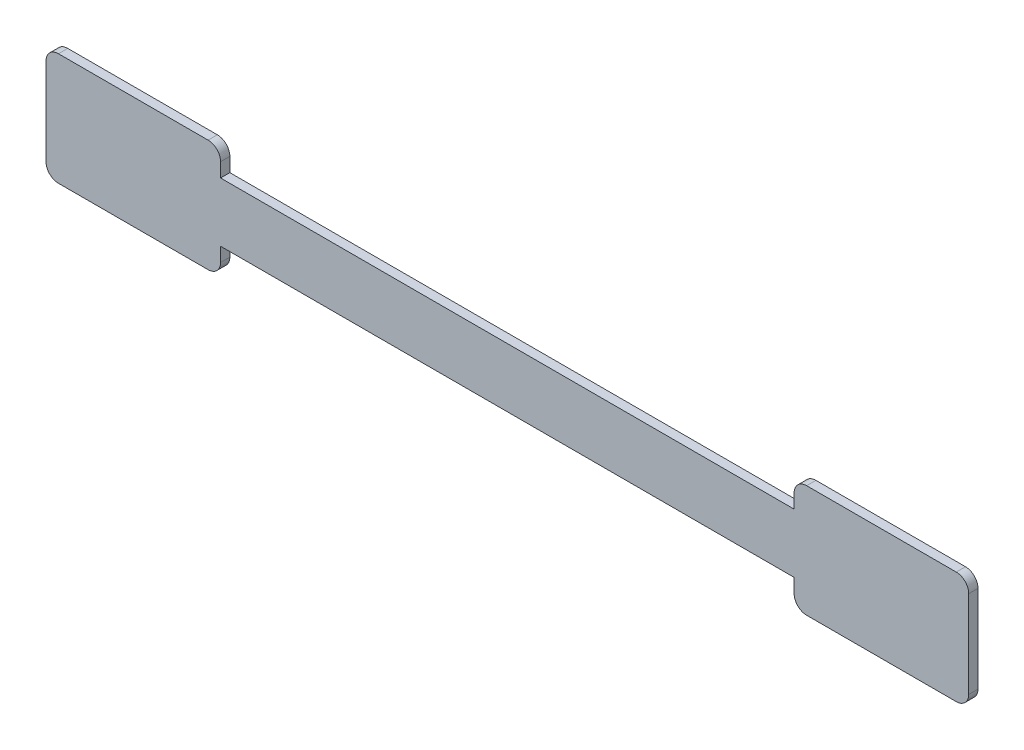
ISO-10303-21;
HEADER;
FILE_DESCRIPTION(('STEP AP214'),'2;1');
FILE_NAME('part.step','',(''),(''),'','','');
FILE_SCHEMA(('AUTOMOTIVE_DESIGN { 1 0 10303 214 1 1 1 1 }'));
ENDSEC;
DATA;
#1=APPLICATION_CONTEXT('core data for automotive mechanical design processes');
#2=APPLICATION_PROTOCOL_DEFINITION('international standard','automotive_design',2000,#1);
#3=PRODUCT_CONTEXT('',#1,'mechanical');
#4=PRODUCT('Part','Part','',(#3));
#5=PRODUCT_RELATED_PRODUCT_CATEGORY('part','',(#4));
#6=PRODUCT_DEFINITION_FORMATION('','',#4);
#7=PRODUCT_DEFINITION_CONTEXT('part definition',#1,'design');
#8=PRODUCT_DEFINITION('design','',#6,#7);
#9=PRODUCT_DEFINITION_SHAPE('','',#8);
#10=(LENGTH_UNIT() NAMED_UNIT(*) SI_UNIT(.MILLI.,.METRE.));
#11=(NAMED_UNIT(*) PLANE_ANGLE_UNIT() SI_UNIT($,.RADIAN.));
#12=(NAMED_UNIT(*) SI_UNIT($,.STERADIAN.) SOLID_ANGLE_UNIT());
#13=UNCERTAINTY_MEASURE_WITH_UNIT(LENGTH_MEASURE(1.E-05),#10,'distance_accuracy_value','');
#14=(GEOMETRIC_REPRESENTATION_CONTEXT(3) GLOBAL_UNCERTAINTY_ASSIGNED_CONTEXT((#13)) GLOBAL_UNIT_ASSIGNED_CONTEXT((#10,
#11,#12)) REPRESENTATION_CONTEXT('',''));
#15=CARTESIAN_POINT('',(0.,0.,0.));
#16=DIRECTION('',(0.,0.,1.));
#17=DIRECTION('',(1.,0.,0.));
#18=AXIS2_PLACEMENT_3D('',#15,#16,#17);
#19=CARTESIAN_POINT('',(0.513181159420287,10.3931811594203,0.));
#20=DIRECTION('',(0.,0.,-1.));
#21=DIRECTION('',(-0.000362187589422425,-0.999999934410073,0.));
#22=AXIS2_PLACEMENT_3D('',#19,#20,#21);
#23=CYLINDRICAL_SURFACE('',#22,0.500181192227135);
#24=DIRECTION('',(0.,0.,1.));
#25=VECTOR('',#24,1.);
#26=CARTESIAN_POINT('',(0.513,9.893,0.));
#27=LINE('',#26,#25);
#28=CARTESIAN_POINT('',(0.513,9.89300000000001,0.02));
#29=VERTEX_POINT('',#28);
#30=CARTESIAN_POINT('',(0.513,9.893,0.39148));
#31=VERTEX_POINT('',#30);
#32=EDGE_CURVE('E11',#29,#31,#27,.T.);
#33=ORIENTED_EDGE('',*,*,#32,.T.);
#34=CARTESIAN_POINT('',(0.513181159420287,10.3931811594203,0.39148));
#35=DIRECTION('',(0.,0.,1.));
#36=DIRECTION('',(1.,0.,0.));
#37=AXIS2_PLACEMENT_3D('',#34,#35,#36);
#38=CIRCLE('',#37,0.500181192227141);
#39=CARTESIAN_POINT('',(0.0130000000000003,10.393,0.39148));
#40=VERTEX_POINT('',#39);
#41=EDGE_CURVE('E50',#40,#31,#38,.T.);
#42=ORIENTED_EDGE('',*,*,#41,.F.);
#43=DIRECTION('',(0.,0.,1.));
#44=VECTOR('',#43,1.);
#45=CARTESIAN_POINT('',(0.0130000000000003,10.393,0.));
#46=LINE('',#45,#44);
#47=CARTESIAN_POINT('',(0.0129999999999945,10.393,0.02));
#48=VERTEX_POINT('',#47);
#49=EDGE_CURVE('E43',#48,#40,#46,.T.);
#50=ORIENTED_EDGE('',*,*,#49,.F.);
#51=CARTESIAN_POINT('',(0.513181159420287,10.3931811594203,0.02));
#52=DIRECTION('',(0.,0.,-1.));
#53=DIRECTION('',(-1.,0.,0.));
#54=AXIS2_PLACEMENT_3D('',#51,#52,#53);
#55=CIRCLE('',#54,0.500181192227141);
#56=EDGE_CURVE('E252',#29,#48,#55,.T.);
#57=ORIENTED_EDGE('',*,*,#56,.F.);
#58=EDGE_LOOP('',(#33,#42,#50,#57));
#59=FACE_BOUND('',#58,.T.);
#60=ADVANCED_FACE('F36',(#59),#23,.T.);
#61=CARTESIAN_POINT('',(0.013,10.393,0.));
#62=DIRECTION('',(-1.,0.,0.));
#63=DIRECTION('',(0.,1.,0.));
#64=AXIS2_PLACEMENT_3D('',#61,#62,#63);
#65=PLANE('',#64);
#66=ORIENTED_EDGE('',*,*,#49,.T.);
#67=DIRECTION('',(0.,-1.,0.));
#68=VECTOR('',#67,1.);
#69=CARTESIAN_POINT('',(0.0129999999999856,13.893,0.39148));
#70=LINE('',#69,#68);
#71=CARTESIAN_POINT('',(0.0129999999999783,13.893,0.39148));
#72=VERTEX_POINT('',#71);
#73=EDGE_CURVE('E248',#72,#40,#70,.T.);
#74=ORIENTED_EDGE('',*,*,#73,.F.);
#75=DIRECTION('',(0.,0.,1.));
#76=VECTOR('',#75,1.);
#77=CARTESIAN_POINT('',(0.0130000000000001,13.893,0.));
#78=LINE('',#77,#76);
#79=CARTESIAN_POINT('',(0.0129999999999925,13.893,0.02));
#80=VERTEX_POINT('',#79);
#81=EDGE_CURVE('E239',#80,#72,#78,.T.);
#82=ORIENTED_EDGE('',*,*,#81,.F.);
#83=DIRECTION('',(0.,1.,0.));
#84=VECTOR('',#83,1.);
#85=CARTESIAN_POINT('',(0.0129999999999945,10.393,0.02));
#86=LINE('',#85,#84);
#87=EDGE_CURVE('E249',#48,#80,#86,.T.);
#88=ORIENTED_EDGE('',*,*,#87,.F.);
#89=EDGE_LOOP('',(#66,#74,#82,#88));
#90=FACE_BOUND('',#89,.T.);
#91=ADVANCED_FACE('F246',(#90),#65,.T.);
#92=CARTESIAN_POINT('',(0.511480769230771,13.8945192307692,0.));
#93=DIRECTION('',(0.,0.,-1.));
#94=DIRECTION('',(-0.99999535572789,-0.0030477077698561,0.));
#95=AXIS2_PLACEMENT_3D('',#92,#93,#94);
#96=CYLINDRICAL_SURFACE('',#95,0.498483084321856);
#97=ORIENTED_EDGE('',*,*,#81,.T.);
#98=CARTESIAN_POINT('',(0.511480769230771,13.8945192307692,0.39148));
#99=DIRECTION('',(0.,0.,1.));
#100=DIRECTION('',(1.,0.,0.));
#101=AXIS2_PLACEMENT_3D('',#98,#99,#100);
#102=CIRCLE('',#101,0.498483084321878);
#103=CARTESIAN_POINT('',(0.513,14.393,0.39148));
#104=VERTEX_POINT('',#103);
#105=EDGE_CURVE('E284',#104,#72,#102,.T.);
#106=ORIENTED_EDGE('',*,*,#105,.F.);
#107=DIRECTION('',(0.,0.,1.));
#108=VECTOR('',#107,1.);
#109=CARTESIAN_POINT('',(0.513,14.393,0.));
#110=LINE('',#109,#108);
#111=CARTESIAN_POINT('',(0.513,14.393,0.02));
#112=VERTEX_POINT('',#111);
#113=EDGE_CURVE('E236',#112,#104,#110,.T.);
#114=ORIENTED_EDGE('',*,*,#113,.F.);
#115=CARTESIAN_POINT('',(0.511480769230771,13.8945192307692,0.02));
#116=DIRECTION('',(0.,0.,-1.));
#117=DIRECTION('',(-1.,0.,0.));
#118=AXIS2_PLACEMENT_3D('',#115,#116,#117);
#119=CIRCLE('',#118,0.498483084321864);
#120=EDGE_CURVE('E289',#80,#112,#119,.T.);
#121=ORIENTED_EDGE('',*,*,#120,.F.);
#122=EDGE_LOOP('',(#97,#106,#114,#121));
#123=FACE_BOUND('',#122,.T.);
#124=ADVANCED_FACE('F397',(#123),#96,.T.);
#125=CARTESIAN_POINT('',(0.513,14.393,0.));
#126=DIRECTION('',(0.,1.,0.));
#127=DIRECTION('',(1.,0.,0.));
#128=AXIS2_PLACEMENT_3D('',#125,#126,#127);
#129=PLANE('',#128);
#130=ORIENTED_EDGE('',*,*,#113,.T.);
#131=DIRECTION('',(-1.,0.,0.));
#132=VECTOR('',#131,1.);
#133=CARTESIAN_POINT('',(6.513,14.393,0.39148));
#134=LINE('',#133,#132);
#135=CARTESIAN_POINT('',(6.513,14.393,0.39148));
#136=VERTEX_POINT('',#135);
#137=EDGE_CURVE('E282',#136,#104,#134,.T.);
#138=ORIENTED_EDGE('',*,*,#137,.F.);
#139=DIRECTION('',(0.,0.,1.));
#140=VECTOR('',#139,1.);
#141=CARTESIAN_POINT('',(6.513,14.393,0.));
#142=LINE('',#141,#140);
#143=CARTESIAN_POINT('',(6.513,14.393,0.02));
#144=VERTEX_POINT('',#143);
#145=EDGE_CURVE('E233',#144,#136,#142,.T.);
#146=ORIENTED_EDGE('',*,*,#145,.F.);
#147=DIRECTION('',(1.,0.,0.));
#148=VECTOR('',#147,1.);
#149=CARTESIAN_POINT('',(0.513,14.393,0.02));
#150=LINE('',#149,#148);
#151=EDGE_CURVE('E291',#112,#144,#150,.T.);
#152=ORIENTED_EDGE('',*,*,#151,.F.);
#153=EDGE_LOOP('',(#130,#138,#146,#152));
#154=FACE_BOUND('',#153,.T.);
#155=ADVANCED_FACE('F393',(#154),#129,.T.);
#156=CARTESIAN_POINT('',(6.5128188405797,13.8928188405797,0.));
#157=DIRECTION('',(0.,0.,-1.));
#158=DIRECTION('',(0.0003621875894313,0.999999934410073,0.));
#159=AXIS2_PLACEMENT_3D('',#156,#157,#158);
#160=CYLINDRICAL_SURFACE('',#159,0.50018119222714);
#161=ORIENTED_EDGE('',*,*,#145,.T.);
#162=CARTESIAN_POINT('',(6.5128188405797,13.8928188405797,0.39148));
#163=DIRECTION('',(0.,0.,1.));
#164=DIRECTION('',(1.,0.,0.));
#165=AXIS2_PLACEMENT_3D('',#162,#163,#164);
#166=CIRCLE('',#165,0.500181192227148);
#167=CARTESIAN_POINT('',(7.013,13.893,0.39148));
#168=VERTEX_POINT('',#167);
#169=EDGE_CURVE('E280',#168,#136,#166,.T.);
#170=ORIENTED_EDGE('',*,*,#169,.F.);
#171=DIRECTION('',(0.,0.,1.));
#172=VECTOR('',#171,1.);
#173=CARTESIAN_POINT('',(7.013,13.893,0.));
#174=LINE('',#173,#172);
#175=CARTESIAN_POINT('',(7.013,13.893,0.02));
#176=VERTEX_POINT('',#175);
#177=EDGE_CURVE('E230',#176,#168,#174,.T.);
#178=ORIENTED_EDGE('',*,*,#177,.F.);
#179=CARTESIAN_POINT('',(6.5128188405797,13.8928188405797,0.02));
#180=DIRECTION('',(0.,0.,-1.));
#181=DIRECTION('',(-1.,0.,0.));
#182=AXIS2_PLACEMENT_3D('',#179,#180,#181);
#183=CIRCLE('',#182,0.500181192227148);
#184=EDGE_CURVE('E293',#144,#176,#183,.T.);
#185=ORIENTED_EDGE('',*,*,#184,.F.);
#186=EDGE_LOOP('',(#161,#170,#178,#185));
#187=FACE_BOUND('',#186,.T.);
#188=ADVANCED_FACE('F388',(#187),#160,.T.);
#189=CARTESIAN_POINT('',(7.013,13.893,0.));
#190=DIRECTION('',(1.,0.,0.));
#191=DIRECTION('',(0.,-1.,0.));
#192=AXIS2_PLACEMENT_3D('',#189,#190,#191);
#193=PLANE('',#192);
#194=ORIENTED_EDGE('',*,*,#177,.T.);
#195=DIRECTION('',(0.,1.,0.));
#196=VECTOR('',#195,1.);
#197=CARTESIAN_POINT('',(7.013,13.328,0.39148));
#198=LINE('',#197,#196);
#199=CARTESIAN_POINT('',(7.013,13.328,0.39148));
#200=VERTEX_POINT('',#199);
#201=EDGE_CURVE('E278',#200,#168,#198,.T.);
#202=ORIENTED_EDGE('',*,*,#201,.F.);
#203=DIRECTION('',(0.,0.,1.));
#204=VECTOR('',#203,1.);
#205=CARTESIAN_POINT('',(7.013,13.328,0.));
#206=LINE('',#205,#204);
#207=CARTESIAN_POINT('',(7.013,13.328,0.02));
#208=VERTEX_POINT('',#207);
#209=EDGE_CURVE('E227',#208,#200,#206,.T.);
#210=ORIENTED_EDGE('',*,*,#209,.F.);
#211=DIRECTION('',(0.,-1.,0.));
#212=VECTOR('',#211,1.);
#213=CARTESIAN_POINT('',(7.013,13.893,0.02));
#214=LINE('',#213,#212);
#215=EDGE_CURVE('E295',#176,#208,#214,.T.);
#216=ORIENTED_EDGE('',*,*,#215,.F.);
#217=EDGE_LOOP('',(#194,#202,#210,#216));
#218=FACE_BOUND('',#217,.T.);
#219=ADVANCED_FACE('F383',(#218),#193,.T.);
#220=CARTESIAN_POINT('',(7.013,13.328,0.));
#221=DIRECTION('',(0.,1.,0.));
#222=DIRECTION('',(1.,0.,0.));
#223=AXIS2_PLACEMENT_3D('',#220,#221,#222);
#224=PLANE('',#223);
#225=ORIENTED_EDGE('',*,*,#209,.T.);
#226=DIRECTION('',(-1.,0.,0.));
#227=VECTOR('',#226,1.);
#228=CARTESIAN_POINT('',(30.013,13.328,0.39148));
#229=LINE('',#228,#227);
#230=CARTESIAN_POINT('',(30.013,13.328,0.39148));
#231=VERTEX_POINT('',#230);
#232=EDGE_CURVE('E276',#231,#200,#229,.T.);
#233=ORIENTED_EDGE('',*,*,#232,.F.);
#234=DIRECTION('',(0.,0.,1.));
#235=VECTOR('',#234,1.);
#236=CARTESIAN_POINT('',(30.013,13.328,0.));
#237=LINE('',#236,#235);
#238=CARTESIAN_POINT('',(30.013,13.328,0.02));
#239=VERTEX_POINT('',#238);
#240=EDGE_CURVE('E224',#239,#231,#237,.T.);
#241=ORIENTED_EDGE('',*,*,#240,.F.);
#242=DIRECTION('',(1.,0.,0.));
#243=VECTOR('',#242,1.);
#244=CARTESIAN_POINT('',(7.013,13.328,0.02));
#245=LINE('',#244,#243);
#246=EDGE_CURVE('E297',#208,#239,#245,.T.);
#247=ORIENTED_EDGE('',*,*,#246,.F.);
#248=EDGE_LOOP('',(#225,#233,#241,#247));
#249=FACE_BOUND('',#248,.T.);
#250=ADVANCED_FACE('F378',(#249),#224,.T.);
#251=CARTESIAN_POINT('',(30.013,13.328,0.));
#252=DIRECTION('',(-1.,0.,0.));
#253=DIRECTION('',(0.,1.,0.));
#254=AXIS2_PLACEMENT_3D('',#251,#252,#253);
#255=PLANE('',#254);
#256=ORIENTED_EDGE('',*,*,#240,.T.);
#257=DIRECTION('',(0.,-1.,0.));
#258=VECTOR('',#257,1.);
#259=CARTESIAN_POINT('',(30.013,13.893,0.39148));
#260=LINE('',#259,#258);
#261=CARTESIAN_POINT('',(30.013,13.893,0.39148));
#262=VERTEX_POINT('',#261);
#263=EDGE_CURVE('E274',#262,#231,#260,.T.);
#264=ORIENTED_EDGE('',*,*,#263,.F.);
#265=DIRECTION('',(0.,0.,1.));
#266=VECTOR('',#265,1.);
#267=CARTESIAN_POINT('',(30.013,13.893,0.));
#268=LINE('',#267,#266);
#269=CARTESIAN_POINT('',(30.013,13.893,0.02));
#270=VERTEX_POINT('',#269);
#271=EDGE_CURVE('E221',#270,#262,#268,.T.);
#272=ORIENTED_EDGE('',*,*,#271,.F.);
#273=DIRECTION('',(0.,1.,0.));
#274=VECTOR('',#273,1.);
#275=CARTESIAN_POINT('',(30.013,13.328,0.02));
#276=LINE('',#275,#274);
#277=EDGE_CURVE('E299',#239,#270,#276,.T.);
#278=ORIENTED_EDGE('',*,*,#277,.F.);
#279=EDGE_LOOP('',(#256,#264,#272,#278));
#280=FACE_BOUND('',#279,.T.);
#281=ADVANCED_FACE('F373',(#280),#255,.T.);
#282=CARTESIAN_POINT('',(30.5114807692308,13.8945192307692,0.));
#283=DIRECTION('',(0.,0.,-1.));
#284=DIRECTION('',(-0.99999535572789,-0.0030477077698633,0.));
#285=AXIS2_PLACEMENT_3D('',#282,#283,#284);
#286=CYLINDRICAL_SURFACE('',#285,0.498483084321851);
#287=ORIENTED_EDGE('',*,*,#271,.T.);
#288=CARTESIAN_POINT('',(30.5114807692308,13.8945192307692,0.39148));
#289=DIRECTION('',(0.,0.,1.));
#290=DIRECTION('',(1.,0.,0.));
#291=AXIS2_PLACEMENT_3D('',#288,#289,#290);
#292=CIRCLE('',#291,0.498483084321885);
#293=CARTESIAN_POINT('',(30.513,14.393,0.39148));
#294=VERTEX_POINT('',#293);
#295=EDGE_CURVE('E272',#294,#262,#292,.T.);
#296=ORIENTED_EDGE('',*,*,#295,.F.);
#297=DIRECTION('',(0.,0.,1.));
#298=VECTOR('',#297,1.);
#299=CARTESIAN_POINT('',(30.513,14.393,0.));
#300=LINE('',#299,#298);
#301=CARTESIAN_POINT('',(30.513,14.393,0.02));
#302=VERTEX_POINT('',#301);
#303=EDGE_CURVE('E218',#302,#294,#300,.T.);
#304=ORIENTED_EDGE('',*,*,#303,.F.);
#305=CARTESIAN_POINT('',(30.5114807692308,13.8945192307692,0.02));
#306=DIRECTION('',(0.,0.,-1.));
#307=DIRECTION('',(-1.,0.,0.));
#308=AXIS2_PLACEMENT_3D('',#305,#306,#307);
#309=CIRCLE('',#308,0.498483084321885);
#310=EDGE_CURVE('E301',#270,#302,#309,.T.);
#311=ORIENTED_EDGE('',*,*,#310,.F.);
#312=EDGE_LOOP('',(#287,#296,#304,#311));
#313=FACE_BOUND('',#312,.T.);
#314=ADVANCED_FACE('F368',(#313),#286,.T.);
#315=CARTESIAN_POINT('',(30.513,14.393,0.));
#316=DIRECTION('',(0.,1.,0.));
#317=DIRECTION('',(1.,0.,0.));
#318=AXIS2_PLACEMENT_3D('',#315,#316,#317);
#319=PLANE('',#318);
#320=ORIENTED_EDGE('',*,*,#303,.T.);
#321=DIRECTION('',(-1.,0.,0.));
#322=VECTOR('',#321,1.);
#323=CARTESIAN_POINT('',(36.513,14.393,0.39148));
#324=LINE('',#323,#322);
#325=CARTESIAN_POINT('',(36.513,14.393,0.39148));
#326=VERTEX_POINT('',#325);
#327=EDGE_CURVE('E270',#326,#294,#324,.T.);
#328=ORIENTED_EDGE('',*,*,#327,.F.);
#329=DIRECTION('',(0.,0.,1.));
#330=VECTOR('',#329,1.);
#331=CARTESIAN_POINT('',(36.513,14.393,0.));
#332=LINE('',#331,#330);
#333=CARTESIAN_POINT('',(36.513,14.393,0.02));
#334=VERTEX_POINT('',#333);
#335=EDGE_CURVE('E215',#334,#326,#332,.T.);
#336=ORIENTED_EDGE('',*,*,#335,.F.);
#337=DIRECTION('',(1.,0.,0.));
#338=VECTOR('',#337,1.);
#339=CARTESIAN_POINT('',(30.513,14.393,0.02));
#340=LINE('',#339,#338);
#341=EDGE_CURVE('E303',#302,#334,#340,.T.);
#342=ORIENTED_EDGE('',*,*,#341,.F.);
#343=EDGE_LOOP('',(#320,#328,#336,#342));
#344=FACE_BOUND('',#343,.T.);
#345=ADVANCED_FACE('F363',(#344),#319,.T.);
#346=CARTESIAN_POINT('',(36.5128188405797,13.8928188405797,0.));
#347=DIRECTION('',(0.,0.,-1.));
#348=DIRECTION('',(0.000362187589434854,0.999999934410073,0.));
#349=AXIS2_PLACEMENT_3D('',#346,#347,#348);
#350=CYLINDRICAL_SURFACE('',#349,0.500181192227139);
#351=ORIENTED_EDGE('',*,*,#335,.T.);
#352=CARTESIAN_POINT('',(36.5128188405797,13.8928188405797,0.39148));
#353=DIRECTION('',(0.,0.,1.));
#354=DIRECTION('',(1.,0.,0.));
#355=AXIS2_PLACEMENT_3D('',#352,#353,#354);
#356=CIRCLE('',#355,0.500181192227148);
#357=CARTESIAN_POINT('',(37.013,13.893,0.39148));
#358=VERTEX_POINT('',#357);
#359=EDGE_CURVE('E268',#358,#326,#356,.T.);
#360=ORIENTED_EDGE('',*,*,#359,.F.);
#361=DIRECTION('',(0.,0.,1.));
#362=VECTOR('',#361,1.);
#363=CARTESIAN_POINT('',(37.013,13.893,0.));
#364=LINE('',#363,#362);
#365=CARTESIAN_POINT('',(37.013,13.893,0.02));
#366=VERTEX_POINT('',#365);
#367=EDGE_CURVE('E212',#366,#358,#364,.T.);
#368=ORIENTED_EDGE('',*,*,#367,.F.);
#369=CARTESIAN_POINT('',(36.5128188405797,13.8928188405797,0.02));
#370=DIRECTION('',(0.,0.,-1.));
#371=DIRECTION('',(-1.,0.,0.));
#372=AXIS2_PLACEMENT_3D('',#369,#370,#371);
#373=CIRCLE('',#372,0.500181192227148);
#374=EDGE_CURVE('E305',#334,#366,#373,.T.);
#375=ORIENTED_EDGE('',*,*,#374,.F.);
#376=EDGE_LOOP('',(#351,#360,#368,#375));
#377=FACE_BOUND('',#376,.T.);
#378=ADVANCED_FACE('F358',(#377),#350,.T.);
#379=CARTESIAN_POINT('',(37.013,13.893,0.));
#380=DIRECTION('',(1.,0.,0.));
#381=DIRECTION('',(0.,-1.,0.));
#382=AXIS2_PLACEMENT_3D('',#379,#380,#381);
#383=PLANE('',#382);
#384=ORIENTED_EDGE('',*,*,#367,.T.);
#385=DIRECTION('',(0.,1.,0.));
#386=VECTOR('',#385,1.);
#387=CARTESIAN_POINT('',(37.013,10.393,0.39148));
#388=LINE('',#387,#386);
#389=CARTESIAN_POINT('',(37.013,10.393,0.39148));
#390=VERTEX_POINT('',#389);
#391=EDGE_CURVE('E266',#390,#358,#388,.T.);
#392=ORIENTED_EDGE('',*,*,#391,.F.);
#393=DIRECTION('',(0.,0.,1.));
#394=VECTOR('',#393,1.);
#395=CARTESIAN_POINT('',(37.013,10.393,0.));
#396=LINE('',#395,#394);
#397=CARTESIAN_POINT('',(37.013,10.393,0.02));
#398=VERTEX_POINT('',#397);
#399=EDGE_CURVE('E209',#398,#390,#396,.T.);
#400=ORIENTED_EDGE('',*,*,#399,.F.);
#401=DIRECTION('',(0.,-1.,0.));
#402=VECTOR('',#401,1.);
#403=CARTESIAN_POINT('',(37.013,13.893,0.02));
#404=LINE('',#403,#402);
#405=EDGE_CURVE('E307',#366,#398,#404,.T.);
#406=ORIENTED_EDGE('',*,*,#405,.F.);
#407=EDGE_LOOP('',(#384,#392,#400,#406));
#408=FACE_BOUND('',#407,.T.);
#409=ADVANCED_FACE('F353',(#408),#383,.T.);
#410=CARTESIAN_POINT('',(36.5111019417476,10.3948980582524,0.));
#411=DIRECTION('',(0.,0.,-1.));
#412=DIRECTION('',(0.999992849220456,-0.003781733458852,0.));
#413=AXIS2_PLACEMENT_3D('',#410,#411,#412);
#414=CYLINDRICAL_SURFACE('',#413,0.501901647240454);
#415=ORIENTED_EDGE('',*,*,#399,.T.);
#416=CARTESIAN_POINT('',(36.5111019417476,10.3948980582524,0.39148));
#417=DIRECTION('',(0.,0.,1.));
#418=DIRECTION('',(1.,0.,0.));
#419=AXIS2_PLACEMENT_3D('',#416,#417,#418);
#420=CIRCLE('',#419,0.50190164724043);
#421=CARTESIAN_POINT('',(36.513,9.893,0.39148));
#422=VERTEX_POINT('',#421);
#423=EDGE_CURVE('E264',#422,#390,#420,.T.);
#424=ORIENTED_EDGE('',*,*,#423,.F.);
#425=DIRECTION('',(0.,0.,1.));
#426=VECTOR('',#425,1.);
#427=CARTESIAN_POINT('',(36.513,9.893,0.));
#428=LINE('',#427,#426);
#429=CARTESIAN_POINT('',(36.513,9.893,0.02));
#430=VERTEX_POINT('',#429);
#431=EDGE_CURVE('E206',#430,#422,#428,.T.);
#432=ORIENTED_EDGE('',*,*,#431,.F.);
#433=CARTESIAN_POINT('',(36.5111019417476,10.3948980582524,0.02));
#434=DIRECTION('',(0.,0.,-1.));
#435=DIRECTION('',(-1.,0.,0.));
#436=AXIS2_PLACEMENT_3D('',#433,#434,#435);
#437=CIRCLE('',#436,0.501901647240429);
#438=EDGE_CURVE('E309',#398,#430,#437,.T.);
#439=ORIENTED_EDGE('',*,*,#438,.F.);
#440=EDGE_LOOP('',(#415,#424,#432,#439));
#441=FACE_BOUND('',#440,.T.);
#442=ADVANCED_FACE('F348',(#441),#414,.T.);
#443=CARTESIAN_POINT('',(36.513,9.893,0.));
#444=DIRECTION('',(0.,-1.,0.));
#445=DIRECTION('',(-1.,0.,0.));
#446=AXIS2_PLACEMENT_3D('',#443,#444,#445);
#447=PLANE('',#446);
#448=ORIENTED_EDGE('',*,*,#431,.T.);
#449=DIRECTION('',(1.,0.,0.));
#450=VECTOR('',#449,1.);
#451=CARTESIAN_POINT('',(30.513,9.893,0.39148));
#452=LINE('',#451,#450);
#453=CARTESIAN_POINT('',(30.513,9.893,0.39148));
#454=VERTEX_POINT('',#453);
#455=EDGE_CURVE('E262',#454,#422,#452,.T.);
#456=ORIENTED_EDGE('',*,*,#455,.F.);
#457=DIRECTION('',(0.,0.,1.));
#458=VECTOR('',#457,1.);
#459=CARTESIAN_POINT('',(30.513,9.893,0.));
#460=LINE('',#459,#458);
#461=CARTESIAN_POINT('',(30.513,9.893,0.02));
#462=VERTEX_POINT('',#461);
#463=EDGE_CURVE('E203',#462,#454,#460,.T.);
#464=ORIENTED_EDGE('',*,*,#463,.F.);
#465=DIRECTION('',(-1.,0.,0.));
#466=VECTOR('',#465,1.);
#467=CARTESIAN_POINT('',(36.513,9.893,0.02));
#468=LINE('',#467,#466);
#469=EDGE_CURVE('E311',#430,#462,#468,.T.);
#470=ORIENTED_EDGE('',*,*,#469,.F.);
#471=EDGE_LOOP('',(#448,#456,#464,#470));
#472=FACE_BOUND('',#471,.T.);
#473=ADVANCED_FACE('F343',(#472),#447,.T.);
#474=CARTESIAN_POINT('',(30.5131811594203,10.3931811594203,0.));
#475=DIRECTION('',(0.,0.,-1.));
#476=DIRECTION('',(-0.000362187589413549,-0.999999934410073,0.));
#477=AXIS2_PLACEMENT_3D('',#474,#475,#476);
#478=CYLINDRICAL_SURFACE('',#477,0.500181192227131);
#479=ORIENTED_EDGE('',*,*,#463,.T.);
#480=CARTESIAN_POINT('',(30.5131811594203,10.3931811594203,0.39148));
#481=DIRECTION('',(0.,0.,1.));
#482=DIRECTION('',(1.,0.,0.));
#483=AXIS2_PLACEMENT_3D('',#480,#481,#482);
#484=CIRCLE('',#483,0.500181192227147);
#485=CARTESIAN_POINT('',(30.013,10.393,0.39148));
#486=VERTEX_POINT('',#485);
#487=EDGE_CURVE('E260',#486,#454,#484,.T.);
#488=ORIENTED_EDGE('',*,*,#487,.F.);
#489=DIRECTION('',(0.,0.,1.));
#490=VECTOR('',#489,1.);
#491=CARTESIAN_POINT('',(30.013,10.393,0.));
#492=LINE('',#491,#490);
#493=CARTESIAN_POINT('',(30.013,10.393,0.02));
#494=VERTEX_POINT('',#493);
#495=EDGE_CURVE('E200',#494,#486,#492,.T.);
#496=ORIENTED_EDGE('',*,*,#495,.F.);
#497=CARTESIAN_POINT('',(30.5131811594203,10.3931811594203,0.02));
#498=DIRECTION('',(0.,0.,-1.));
#499=DIRECTION('',(-1.,0.,0.));
#500=AXIS2_PLACEMENT_3D('',#497,#498,#499);
#501=CIRCLE('',#500,0.500181192227147);
#502=EDGE_CURVE('E313',#462,#494,#501,.T.);
#503=ORIENTED_EDGE('',*,*,#502,.F.);
#504=EDGE_LOOP('',(#479,#488,#496,#503));
#505=FACE_BOUND('',#504,.T.);
#506=ADVANCED_FACE('F338',(#505),#478,.T.);
#507=CARTESIAN_POINT('',(30.013,10.393,0.));
#508=DIRECTION('',(-1.,0.,0.));
#509=DIRECTION('',(0.,1.,0.));
#510=AXIS2_PLACEMENT_3D('',#507,#508,#509);
#511=PLANE('',#510);
#512=ORIENTED_EDGE('',*,*,#495,.T.);
#513=DIRECTION('',(0.,-1.,0.));
#514=VECTOR('',#513,1.);
#515=CARTESIAN_POINT('',(30.013,10.958,0.39148));
#516=LINE('',#515,#514);
#517=CARTESIAN_POINT('',(30.013,10.958,0.39148));
#518=VERTEX_POINT('',#517);
#519=EDGE_CURVE('E258',#518,#486,#516,.T.);
#520=ORIENTED_EDGE('',*,*,#519,.F.);
#521=DIRECTION('',(0.,0.,1.));
#522=VECTOR('',#521,1.);
#523=CARTESIAN_POINT('',(30.013,10.958,0.));
#524=LINE('',#523,#522);
#525=CARTESIAN_POINT('',(30.013,10.958,0.02));
#526=VERTEX_POINT('',#525);
#527=EDGE_CURVE('E197',#526,#518,#524,.T.);
#528=ORIENTED_EDGE('',*,*,#527,.F.);
#529=DIRECTION('',(0.,1.,0.));
#530=VECTOR('',#529,1.);
#531=CARTESIAN_POINT('',(30.013,10.393,0.02));
#532=LINE('',#531,#530);
#533=EDGE_CURVE('E315',#494,#526,#532,.T.);
#534=ORIENTED_EDGE('',*,*,#533,.F.);
#535=EDGE_LOOP('',(#512,#520,#528,#534));
#536=FACE_BOUND('',#535,.T.);
#537=ADVANCED_FACE('F333',(#536),#511,.T.);
#538=CARTESIAN_POINT('',(30.013,10.958,0.));
#539=DIRECTION('',(0.,-1.,0.));
#540=DIRECTION('',(-1.,0.,0.));
#541=AXIS2_PLACEMENT_3D('',#538,#539,#540);
#542=PLANE('',#541);
#543=ORIENTED_EDGE('',*,*,#527,.T.);
#544=DIRECTION('',(1.,0.,0.));
#545=VECTOR('',#544,1.);
#546=CARTESIAN_POINT('',(7.013,10.958,0.39148));
#547=LINE('',#546,#545);
#548=CARTESIAN_POINT('',(7.013,10.958,0.39148));
#549=VERTEX_POINT('',#548);
#550=EDGE_CURVE('E256',#549,#518,#547,.T.);
#551=ORIENTED_EDGE('',*,*,#550,.F.);
#552=DIRECTION('',(0.,0.,1.));
#553=VECTOR('',#552,1.);
#554=CARTESIAN_POINT('',(7.013,10.958,0.));
#555=LINE('',#554,#553);
#556=CARTESIAN_POINT('',(7.013,10.958,0.02));
#557=VERTEX_POINT('',#556);
#558=EDGE_CURVE('E190',#557,#549,#555,.T.);
#559=ORIENTED_EDGE('',*,*,#558,.F.);
#560=DIRECTION('',(-1.,0.,0.));
#561=VECTOR('',#560,1.);
#562=CARTESIAN_POINT('',(30.013,10.958,0.02));
#563=LINE('',#562,#561);
#564=EDGE_CURVE('E317',#526,#557,#563,.T.);
#565=ORIENTED_EDGE('',*,*,#564,.F.);
#566=EDGE_LOOP('',(#543,#551,#559,#565));
#567=FACE_BOUND('',#566,.T.);
#568=ADVANCED_FACE('F329',(#567),#542,.T.);
#569=CARTESIAN_POINT('',(7.013,10.958,0.));
#570=DIRECTION('',(1.,0.,0.));
#571=DIRECTION('',(0.,-1.,0.));
#572=AXIS2_PLACEMENT_3D('',#569,#570,#571);
#573=PLANE('',#572);
#574=ORIENTED_EDGE('',*,*,#558,.T.);
#575=DIRECTION('',(0.,1.,0.));
#576=VECTOR('',#575,1.);
#577=CARTESIAN_POINT('',(7.013,10.393,0.39148));
#578=LINE('',#577,#576);
#579=CARTESIAN_POINT('',(7.013,10.393,0.39148));
#580=VERTEX_POINT('',#579);
#581=EDGE_CURVE('E185',#580,#549,#578,.T.);
#582=ORIENTED_EDGE('',*,*,#581,.F.);
#583=DIRECTION('',(0.,0.,1.));
#584=VECTOR('',#583,1.);
#585=CARTESIAN_POINT('',(7.013,10.393,0.));
#586=LINE('',#585,#584);
#587=CARTESIAN_POINT('',(7.013,10.393,0.02));
#588=VERTEX_POINT('',#587);
#589=EDGE_CURVE('E184',#588,#580,#586,.T.);
#590=ORIENTED_EDGE('',*,*,#589,.F.);
#591=DIRECTION('',(0.,-1.,0.));
#592=VECTOR('',#591,1.);
#593=CARTESIAN_POINT('',(7.013,10.958,0.02));
#594=LINE('',#593,#592);
#595=EDGE_CURVE('E319',#557,#588,#594,.T.);
#596=ORIENTED_EDGE('',*,*,#595,.F.);
#597=EDGE_LOOP('',(#574,#582,#590,#596));
#598=FACE_BOUND('',#597,.T.);
#599=ADVANCED_FACE('F325',(#598),#573,.T.);
#600=CARTESIAN_POINT('',(6.5111019417476,10.3948980582524,0.));
#601=DIRECTION('',(0.,0.,-1.));
#602=DIRECTION('',(0.999992849220456,-0.0037817334588591,0.));
#603=AXIS2_PLACEMENT_3D('',#600,#601,#602);
#604=CYLINDRICAL_SURFACE('',#603,0.501901647240457);
#605=ORIENTED_EDGE('',*,*,#589,.T.);
#606=CARTESIAN_POINT('',(6.5111019417476,10.3948980582524,0.39148));
#607=DIRECTION('',(0.,0.,1.));
#608=DIRECTION('',(1.,0.,0.));
#609=AXIS2_PLACEMENT_3D('',#606,#607,#608);
#610=CIRCLE('',#609,0.501901647240432);
#611=CARTESIAN_POINT('',(6.513,9.893,0.39148));
#612=VERTEX_POINT('',#611);
#613=EDGE_CURVE('E172',#612,#580,#610,.T.);
#614=ORIENTED_EDGE('',*,*,#613,.F.);
#615=DIRECTION('',(0.,0.,1.));
#616=VECTOR('',#615,1.);
#617=CARTESIAN_POINT('',(6.513,9.893,0.));
#618=LINE('',#617,#616);
#619=CARTESIAN_POINT('',(6.513,9.893,0.02));
#620=VERTEX_POINT('',#619);
#621=EDGE_CURVE('E182',#620,#612,#618,.T.);
#622=ORIENTED_EDGE('',*,*,#621,.F.);
#623=CARTESIAN_POINT('',(6.5111019417476,10.3948980582524,0.02));
#624=DIRECTION('',(0.,0.,-1.));
#625=DIRECTION('',(-1.,0.,0.));
#626=AXIS2_PLACEMENT_3D('',#623,#624,#625);
#627=CIRCLE('',#626,0.501901647240432);
#628=EDGE_CURVE('E58',#588,#620,#627,.T.);
#629=ORIENTED_EDGE('',*,*,#628,.F.);
#630=EDGE_LOOP('',(#605,#614,#622,#629));
#631=FACE_BOUND('',#630,.T.);
#632=ADVANCED_FACE('F181',(#631),#604,.T.);
#633=CARTESIAN_POINT('',(6.513,9.893,0.));
#634=DIRECTION('',(0.,-1.,0.));
#635=DIRECTION('',(-1.,0.,0.));
#636=AXIS2_PLACEMENT_3D('',#633,#634,#635);
#637=PLANE('',#636);
#638=ORIENTED_EDGE('',*,*,#621,.T.);
#639=DIRECTION('',(1.,0.,0.));
#640=VECTOR('',#639,1.);
#641=CARTESIAN_POINT('',(0.513,9.893,0.39148));
#642=LINE('',#641,#640);
#643=EDGE_CURVE('E169',#31,#612,#642,.T.);
#644=ORIENTED_EDGE('',*,*,#643,.F.);
#645=ORIENTED_EDGE('',*,*,#32,.F.);
#646=DIRECTION('',(-1.,0.,0.));
#647=VECTOR('',#646,1.);
#648=CARTESIAN_POINT('',(6.513,9.893,0.02));
#649=LINE('',#648,#647);
#650=EDGE_CURVE('E188',#620,#29,#649,.T.);
#651=ORIENTED_EDGE('',*,*,#650,.F.);
#652=EDGE_LOOP('',(#638,#644,#645,#651));
#653=FACE_BOUND('',#652,.T.);
#654=ADVANCED_FACE('F187',(#653),#637,.T.);
#655=CARTESIAN_POINT('',(0.513181159420287,10.3931811594203,0.02));
#656=DIRECTION('',(0.,0.,-1.));
#657=DIRECTION('',(-1.,0.,0.));
#658=AXIS2_PLACEMENT_3D('',#655,#656,#657);
#659=PLANE('',#658);
#660=ORIENTED_EDGE('',*,*,#56,.T.);
#661=ORIENTED_EDGE('',*,*,#87,.T.);
#662=ORIENTED_EDGE('',*,*,#120,.T.);
#663=ORIENTED_EDGE('',*,*,#151,.T.);
#664=ORIENTED_EDGE('',*,*,#184,.T.);
#665=ORIENTED_EDGE('',*,*,#215,.T.);
#666=ORIENTED_EDGE('',*,*,#246,.T.);
#667=ORIENTED_EDGE('',*,*,#277,.T.);
#668=ORIENTED_EDGE('',*,*,#310,.T.);
#669=ORIENTED_EDGE('',*,*,#341,.T.);
#670=ORIENTED_EDGE('',*,*,#374,.T.);
#671=ORIENTED_EDGE('',*,*,#405,.T.);
#672=ORIENTED_EDGE('',*,*,#438,.T.);
#673=ORIENTED_EDGE('',*,*,#469,.T.);
#674=ORIENTED_EDGE('',*,*,#502,.T.);
#675=ORIENTED_EDGE('',*,*,#533,.T.);
#676=ORIENTED_EDGE('',*,*,#564,.T.);
#677=ORIENTED_EDGE('',*,*,#595,.T.);
#678=ORIENTED_EDGE('',*,*,#628,.T.);
#679=ORIENTED_EDGE('',*,*,#650,.T.);
#680=EDGE_LOOP('',(#660,#661,#662,#663,#664,#665,#666,#667,#668,#669,#670,#671,#672,#673,#674,
#675,#676,#677,#678,#679));
#681=FACE_BOUND('',#680,.T.);
#682=ADVANCED_FACE('F321',(#681),#659,.T.);
#683=CARTESIAN_POINT('',(0.513181159420287,10.3931811594203,0.39148));
#684=DIRECTION('',(0.,0.,1.));
#685=DIRECTION('',(1.,0.,0.));
#686=AXIS2_PLACEMENT_3D('',#683,#684,#685);
#687=PLANE('',#686);
#688=ORIENTED_EDGE('',*,*,#41,.T.);
#689=ORIENTED_EDGE('',*,*,#643,.T.);
#690=ORIENTED_EDGE('',*,*,#613,.T.);
#691=ORIENTED_EDGE('',*,*,#581,.T.);
#692=ORIENTED_EDGE('',*,*,#550,.T.);
#693=ORIENTED_EDGE('',*,*,#519,.T.);
#694=ORIENTED_EDGE('',*,*,#487,.T.);
#695=ORIENTED_EDGE('',*,*,#455,.T.);
#696=ORIENTED_EDGE('',*,*,#423,.T.);
#697=ORIENTED_EDGE('',*,*,#391,.T.);
#698=ORIENTED_EDGE('',*,*,#359,.T.);
#699=ORIENTED_EDGE('',*,*,#327,.T.);
#700=ORIENTED_EDGE('',*,*,#295,.T.);
#701=ORIENTED_EDGE('',*,*,#263,.T.);
#702=ORIENTED_EDGE('',*,*,#232,.T.);
#703=ORIENTED_EDGE('',*,*,#201,.T.);
#704=ORIENTED_EDGE('',*,*,#169,.T.);
#705=ORIENTED_EDGE('',*,*,#137,.T.);
#706=ORIENTED_EDGE('',*,*,#105,.T.);
#707=ORIENTED_EDGE('',*,*,#73,.T.);
#708=EDGE_LOOP('',(#688,#689,#690,#691,#692,#693,#694,#695,#696,#697,#698,#699,#700,#701,#702,
#703,#704,#705,#706,#707));
#709=FACE_BOUND('',#708,.T.);
#710=ADVANCED_FACE('F171',(#709),#687,.T.);
#711=CLOSED_SHELL('',(#60,#91,#124,#155,#188,#219,#250,#281,#314,#345,#378,#409,#442,#473,#506,
#537,#568,#599,#632,#654,#682,#710));
#712=MANIFOLD_SOLID_BREP('B2',#711);
#713=ADVANCED_BREP_SHAPE_REPRESENTATION('',(#18,#712),#14);
#714=SHAPE_DEFINITION_REPRESENTATION(#9,#713);
ENDSEC;
END-ISO-10303-21;
